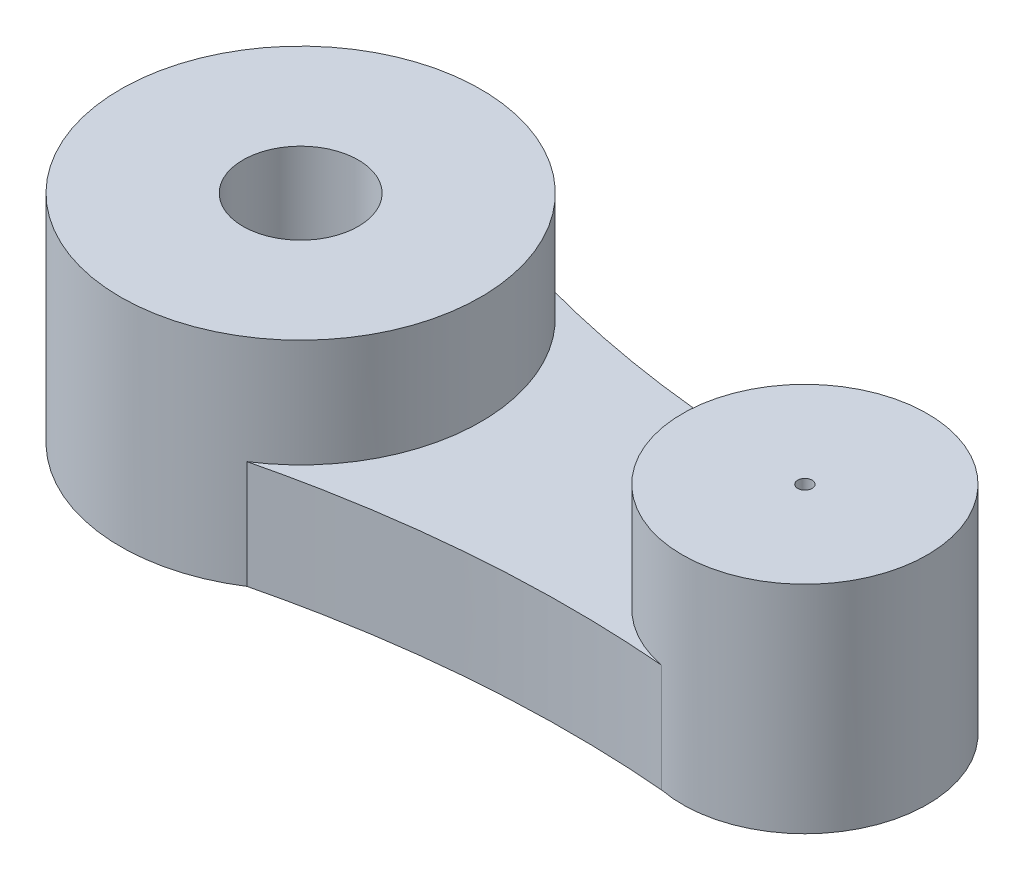
ISO-10303-21;
HEADER;
FILE_DESCRIPTION(('STEP AP214'),'2;1');
FILE_NAME('part.step','',(''),(''),'','','');
FILE_SCHEMA(('AUTOMOTIVE_DESIGN { 1 0 10303 214 1 1 1 1 }'));
ENDSEC;
DATA;
#1=APPLICATION_CONTEXT('core data for automotive mechanical design processes');
#2=APPLICATION_PROTOCOL_DEFINITION('international standard','automotive_design',2000,#1);
#3=PRODUCT_CONTEXT('',#1,'mechanical');
#4=PRODUCT('Part','Part','',(#3));
#5=PRODUCT_RELATED_PRODUCT_CATEGORY('part','',(#4));
#6=PRODUCT_DEFINITION_FORMATION('','',#4);
#7=PRODUCT_DEFINITION_CONTEXT('part definition',#1,'design');
#8=PRODUCT_DEFINITION('design','',#6,#7);
#9=PRODUCT_DEFINITION_SHAPE('','',#8);
#10=(LENGTH_UNIT() NAMED_UNIT(*) SI_UNIT(.MILLI.,.METRE.));
#11=(NAMED_UNIT(*) PLANE_ANGLE_UNIT() SI_UNIT($,.RADIAN.));
#12=(NAMED_UNIT(*) SI_UNIT($,.STERADIAN.) SOLID_ANGLE_UNIT());
#13=UNCERTAINTY_MEASURE_WITH_UNIT(LENGTH_MEASURE(1.E-05),#10,'distance_accuracy_value','');
#14=(GEOMETRIC_REPRESENTATION_CONTEXT(3) GLOBAL_UNCERTAINTY_ASSIGNED_CONTEXT((#13)) GLOBAL_UNIT_ASSIGNED_CONTEXT((#10,
#11,#12)) REPRESENTATION_CONTEXT('',''));
#15=CARTESIAN_POINT('',(0.,0.,0.));
#16=DIRECTION('',(0.,0.,1.));
#17=DIRECTION('',(1.,0.,0.));
#18=AXIS2_PLACEMENT_3D('',#15,#16,#17);
#19=CARTESIAN_POINT('',(0.,15.,0.));
#20=DIRECTION('',(0.,-1.,0.));
#21=DIRECTION('',(0.,0.,-1.));
#22=AXIS2_PLACEMENT_3D('',#19,#20,#21);
#23=CYLINDRICAL_SURFACE('',#22,12.5);
#24=CARTESIAN_POINT('',(0.,15.,0.));
#25=DIRECTION('',(0.,1.,0.));
#26=DIRECTION('',(0.,0.,1.));
#27=AXIS2_PLACEMENT_3D('',#24,#25,#26);
#28=CIRCLE('',#27,12.5);
#29=CARTESIAN_POINT('',(0.,15.,12.5));
#30=VERTEX_POINT('',#29);
#31=EDGE_CURVE('E11',#30,#30,#28,.T.);
#32=ORIENTED_EDGE('',*,*,#31,.F.);
#33=EDGE_LOOP('',(#32));
#34=FACE_BOUND('',#33,.T.);
#35=CARTESIAN_POINT('',(0.,7.5,0.));
#36=DIRECTION('',(0.,1.,0.));
#37=DIRECTION('',(0.,0.,-1.));
#38=AXIS2_PLACEMENT_3D('',#35,#36,#37);
#39=CIRCLE('',#38,12.5);
#40=CARTESIAN_POINT('',(6.77893907780912,7.5,10.5021895326333));
#41=VERTEX_POINT('',#40);
#42=CARTESIAN_POINT('',(6.77893907780912,7.5,-10.5021895326333));
#43=VERTEX_POINT('',#42);
#44=EDGE_CURVE('E64',#41,#43,#39,.T.);
#45=ORIENTED_EDGE('',*,*,#44,.T.);
#46=DIRECTION('',(0.,-1.,0.));
#47=VECTOR('',#46,1.);
#48=CARTESIAN_POINT('',(6.77893907780911,7.5,-10.5021895326333));
#49=LINE('',#48,#47);
#50=CARTESIAN_POINT('',(6.77893907780911,0.,-10.5021895326333));
#51=VERTEX_POINT('',#50);
#52=EDGE_CURVE('E260',#43,#51,#49,.T.);
#53=ORIENTED_EDGE('',*,*,#52,.T.);
#54=CARTESIAN_POINT('',(0.,0.,0.));
#55=DIRECTION('',(0.,1.,0.));
#56=DIRECTION('',(0.,0.,1.));
#57=AXIS2_PLACEMENT_3D('',#54,#55,#56);
#58=CIRCLE('',#57,12.5);
#59=CARTESIAN_POINT('',(6.77893907780912,0.,10.5021895326333));
#60=VERTEX_POINT('',#59);
#61=EDGE_CURVE('E47',#51,#60,#58,.T.);
#62=ORIENTED_EDGE('',*,*,#61,.T.);
#63=DIRECTION('',(0.,-1.,0.));
#64=VECTOR('',#63,1.);
#65=CARTESIAN_POINT('',(6.77893907780912,7.5,10.5021895326333));
#66=LINE('',#65,#64);
#67=EDGE_CURVE('E59',#41,#60,#66,.T.);
#68=ORIENTED_EDGE('',*,*,#67,.F.);
#69=EDGE_LOOP('',(#45,#53,#62,#68));
#70=FACE_BOUND('',#69,.T.);
#71=ADVANCED_FACE('F44',(#34,#70),#23,.T.);
#72=CARTESIAN_POINT('',(0.,15.,0.));
#73=DIRECTION('',(0.,1.,0.));
#74=DIRECTION('',(0.,0.,1.));
#75=AXIS2_PLACEMENT_3D('',#72,#73,#74);
#76=PLANE('',#75);
#77=CARTESIAN_POINT('',(0.,15.,0.));
#78=DIRECTION('',(0.,1.,0.));
#79=DIRECTION('',(0.,0.,1.));
#80=AXIS2_PLACEMENT_3D('',#77,#78,#79);
#81=CIRCLE('',#80,3.99999999999999);
#82=CARTESIAN_POINT('',(0.,15.,3.99999999999999));
#83=VERTEX_POINT('',#82);
#84=EDGE_CURVE('E244',#83,#83,#81,.T.);
#85=ORIENTED_EDGE('',*,*,#84,.F.);
#86=EDGE_LOOP('',(#85));
#87=FACE_BOUND('',#86,.T.);
#88=ORIENTED_EDGE('',*,*,#31,.T.);
#89=EDGE_LOOP('',(#88));
#90=FACE_BOUND('',#89,.T.);
#91=ADVANCED_FACE('F134',(#87,#90),#76,.T.);
#92=CARTESIAN_POINT('',(0.,0.,0.));
#93=DIRECTION('',(0.,1.,0.));
#94=DIRECTION('',(0.,0.,1.));
#95=AXIS2_PLACEMENT_3D('',#92,#93,#94);
#96=PLANE('',#95);
#97=CARTESIAN_POINT('',(35.,0.,0.));
#98=DIRECTION('',(0.,1.,0.));
#99=DIRECTION('',(0.,0.,1.));
#100=AXIS2_PLACEMENT_3D('',#97,#98,#99);
#101=CIRCLE('',#100,0.499999999999999);
#102=CARTESIAN_POINT('',(35.,0.,0.499999999999999));
#103=VERTEX_POINT('',#102);
#104=EDGE_CURVE('E248',#103,#103,#101,.T.);
#105=ORIENTED_EDGE('',*,*,#104,.T.);
#106=EDGE_LOOP('',(#105));
#107=FACE_BOUND('',#106,.T.);
#108=CARTESIAN_POINT('',(0.,0.,0.));
#109=DIRECTION('',(0.,1.,0.));
#110=DIRECTION('',(0.,0.,1.));
#111=AXIS2_PLACEMENT_3D('',#108,#109,#110);
#112=CIRCLE('',#111,4.);
#113=CARTESIAN_POINT('',(0.,0.,4.));
#114=VERTEX_POINT('',#113);
#115=EDGE_CURVE('E239',#114,#114,#112,.T.);
#116=ORIENTED_EDGE('',*,*,#115,.T.);
#117=EDGE_LOOP('',(#116));
#118=FACE_BOUND('',#117,.T.);
#119=ORIENTED_EDGE('',*,*,#61,.F.);
#120=CARTESIAN_POINT('',(6.77893907780912,0.,-10.5021895326333));
#121=CARTESIAN_POINT('',(20.0780701139765,0.,-6.87736251216738));
#122=CARTESIAN_POINT('',(32.9530224181026,0.,-8.24984137903327));
#123=B_SPLINE_CURVE_WITH_KNOTS('',2,(#120,#121,#122),.UNSPECIFIED.,.F.,.F.,(3,3),(0.,
0.617827195606495),.UNSPECIFIED.);
#124=CARTESIAN_POINT('',(32.9530224181026,0.,-8.24984137903326));
#125=VERTEX_POINT('',#124);
#126=EDGE_CURVE('E233',#51,#125,#123,.T.);
#127=ORIENTED_EDGE('',*,*,#126,.T.);
#128=CARTESIAN_POINT('',(35.,0.,0.));
#129=DIRECTION('',(0.,1.,0.));
#130=DIRECTION('',(0.,0.,1.));
#131=AXIS2_PLACEMENT_3D('',#128,#129,#130);
#132=CIRCLE('',#131,8.50000000000001);
#133=CARTESIAN_POINT('',(33.4112747408195,0.,8.3502067070727));
#134=VERTEX_POINT('',#133);
#135=EDGE_CURVE('E234',#134,#125,#132,.T.);
#136=ORIENTED_EDGE('',*,*,#135,.F.);
#137=CARTESIAN_POINT('',(33.4112747408195,0.,8.3502067070727));
#138=CARTESIAN_POINT('',(20.2255071541268,0.,7.23953667088592));
#139=CARTESIAN_POINT('',(6.77893907780912,0.,10.5021895326333));
#140=B_SPLINE_CURVE_WITH_KNOTS('',2,(#137,#138,#139),.UNSPECIFIED.,.F.,.F.,(3,3),(0.,
0.631379274317981),.UNSPECIFIED.);
#141=EDGE_CURVE('E97',#134,#60,#140,.T.);
#142=ORIENTED_EDGE('',*,*,#141,.T.);
#143=EDGE_LOOP('',(#119,#127,#136,#142));
#144=FACE_BOUND('',#143,.T.);
#145=ADVANCED_FACE('F132',(#107,#118,#144),#96,.F.);
#146=CARTESIAN_POINT('',(6.77893907780912,7.5,-10.5021895326333));
#147=CARTESIAN_POINT('',(20.0780701139765,7.5,-6.87736251216738));
#148=CARTESIAN_POINT('',(32.9530224181026,7.5,-8.24984137903327));
#149=B_SPLINE_CURVE_WITH_KNOTS('',2,(#146,#147,#148),.UNSPECIFIED.,.F.,.F.,(3,3),(0.,
0.617827195606495),.UNSPECIFIED.);
#150=DIRECTION('',(0.,-1.,0.));
#151=VECTOR('',#150,1.);
#152=SURFACE_OF_LINEAR_EXTRUSION('',#149,#151);
#153=ORIENTED_EDGE('',*,*,#126,.F.);
#154=ORIENTED_EDGE('',*,*,#52,.F.);
#155=CARTESIAN_POINT('',(32.9530224181026,7.5,-8.24984137903326));
#156=VERTEX_POINT('',#155);
#157=EDGE_CURVE('E108',#43,#156,#149,.T.);
#158=ORIENTED_EDGE('',*,*,#157,.T.);
#159=DIRECTION('',(0.,-1.,0.));
#160=VECTOR('',#159,1.);
#161=CARTESIAN_POINT('',(32.9530224181026,7.5,-8.24984137903326));
#162=LINE('',#161,#160);
#163=EDGE_CURVE('E102',#156,#125,#162,.T.);
#164=ORIENTED_EDGE('',*,*,#163,.T.);
#165=EDGE_LOOP('',(#153,#154,#158,#164));
#166=FACE_BOUND('',#165,.T.);
#167=ADVANCED_FACE('F128',(#166),#152,.T.);
#168=CARTESIAN_POINT('',(33.4112747408195,7.5,8.3502067070727));
#169=CARTESIAN_POINT('',(20.2255071541268,7.5,7.23953667088592));
#170=CARTESIAN_POINT('',(6.77893907780912,7.5,10.5021895326333));
#171=B_SPLINE_CURVE_WITH_KNOTS('',2,(#168,#169,#170),.UNSPECIFIED.,.F.,.F.,(3,3),(0.,
0.631379274317981),.UNSPECIFIED.);
#172=DIRECTION('',(0.,-1.,0.));
#173=VECTOR('',#172,1.);
#174=SURFACE_OF_LINEAR_EXTRUSION('',#171,#173);
#175=ORIENTED_EDGE('',*,*,#141,.F.);
#176=DIRECTION('',(0.,-1.,0.));
#177=VECTOR('',#176,1.);
#178=CARTESIAN_POINT('',(33.4112747408195,7.5,8.3502067070727));
#179=LINE('',#178,#177);
#180=CARTESIAN_POINT('',(33.4112747408195,7.5,8.35020670707271));
#181=VERTEX_POINT('',#180);
#182=EDGE_CURVE('E94',#181,#134,#179,.T.);
#183=ORIENTED_EDGE('',*,*,#182,.F.);
#184=EDGE_CURVE('E83',#181,#41,#171,.T.);
#185=ORIENTED_EDGE('',*,*,#184,.T.);
#186=ORIENTED_EDGE('',*,*,#67,.T.);
#187=EDGE_LOOP('',(#175,#183,#185,#186));
#188=FACE_BOUND('',#187,.T.);
#189=ADVANCED_FACE('F95',(#188),#174,.T.);
#190=CARTESIAN_POINT('',(19.9720254309662,7.5,-8.12668898400033));
#191=DIRECTION('',(0.,-1.,0.));
#192=DIRECTION('',(0.,0.,-1.));
#193=AXIS2_PLACEMENT_3D('',#190,#191,#192);
#194=PLANE('',#193);
#195=ORIENTED_EDGE('',*,*,#157,.F.);
#196=ORIENTED_EDGE('',*,*,#44,.F.);
#197=ORIENTED_EDGE('',*,*,#184,.F.);
#198=CARTESIAN_POINT('',(35.,7.5,0.));
#199=DIRECTION('',(0.,1.,0.));
#200=DIRECTION('',(0.,0.,1.));
#201=AXIS2_PLACEMENT_3D('',#198,#199,#200);
#202=CIRCLE('',#201,8.50000000000001);
#203=EDGE_CURVE('E88',#156,#181,#202,.T.);
#204=ORIENTED_EDGE('',*,*,#203,.F.);
#205=EDGE_LOOP('',(#195,#196,#197,#204));
#206=FACE_BOUND('',#205,.T.);
#207=ADVANCED_FACE('F86',(#206),#194,.F.);
#208=CARTESIAN_POINT('',(35.,15.,0.));
#209=DIRECTION('',(0.,-1.,0.));
#210=DIRECTION('',(0.,0.,-1.));
#211=AXIS2_PLACEMENT_3D('',#208,#209,#210);
#212=CYLINDRICAL_SURFACE('',#211,8.50000000000001);
#213=ORIENTED_EDGE('',*,*,#163,.F.);
#214=ORIENTED_EDGE('',*,*,#203,.T.);
#215=ORIENTED_EDGE('',*,*,#182,.T.);
#216=ORIENTED_EDGE('',*,*,#135,.T.);
#217=EDGE_LOOP('',(#213,#214,#215,#216));
#218=FACE_BOUND('',#217,.T.);
#219=CARTESIAN_POINT('',(35.,15.,0.));
#220=DIRECTION('',(0.,1.,0.));
#221=DIRECTION('',(0.,0.,1.));
#222=AXIS2_PLACEMENT_3D('',#219,#220,#221);
#223=CIRCLE('',#222,8.50000000000001);
#224=CARTESIAN_POINT('',(35.,15.,8.50000000000001));
#225=VERTEX_POINT('',#224);
#226=EDGE_CURVE('E231',#225,#225,#223,.T.);
#227=ORIENTED_EDGE('',*,*,#226,.F.);
#228=EDGE_LOOP('',(#227));
#229=FACE_BOUND('',#228,.T.);
#230=ADVANCED_FACE('F105',(#218,#229),#212,.T.);
#231=CARTESIAN_POINT('',(35.,15.,0.));
#232=DIRECTION('',(0.,1.,0.));
#233=DIRECTION('',(0.,0.,1.));
#234=AXIS2_PLACEMENT_3D('',#231,#232,#233);
#235=PLANE('',#234);
#236=CARTESIAN_POINT('',(35.,15.,0.));
#237=DIRECTION('',(0.,1.,0.));
#238=DIRECTION('',(0.,0.,1.));
#239=AXIS2_PLACEMENT_3D('',#236,#237,#238);
#240=CIRCLE('',#239,0.499999999999999);
#241=CARTESIAN_POINT('',(35.,15.,0.499999999999999));
#242=VERTEX_POINT('',#241);
#243=EDGE_CURVE('E228',#242,#242,#240,.T.);
#244=ORIENTED_EDGE('',*,*,#243,.F.);
#245=EDGE_LOOP('',(#244));
#246=FACE_BOUND('',#245,.T.);
#247=ORIENTED_EDGE('',*,*,#226,.T.);
#248=EDGE_LOOP('',(#247));
#249=FACE_BOUND('',#248,.T.);
#250=ADVANCED_FACE('F175',(#246,#249),#235,.T.);
#251=CARTESIAN_POINT('',(0.,15.,0.));
#252=DIRECTION('',(0.,1.,0.));
#253=DIRECTION('',(0.,0.,1.));
#254=AXIS2_PLACEMENT_3D('',#251,#252,#253);
#255=CYLINDRICAL_SURFACE('',#254,3.99999999999999);
#256=ORIENTED_EDGE('',*,*,#115,.F.);
#257=EDGE_LOOP('',(#256));
#258=FACE_BOUND('',#257,.T.);
#259=ORIENTED_EDGE('',*,*,#84,.T.);
#260=EDGE_LOOP('',(#259));
#261=FACE_BOUND('',#260,.T.);
#262=ADVANCED_FACE('F185',(#258,#261),#255,.F.);
#263=CARTESIAN_POINT('',(35.,0.,0.));
#264=DIRECTION('',(0.,1.,0.));
#265=DIRECTION('',(0.,0.,1.));
#266=AXIS2_PLACEMENT_3D('',#263,#264,#265);
#267=CYLINDRICAL_SURFACE('',#266,0.499999999999999);
#268=ORIENTED_EDGE('',*,*,#104,.F.);
#269=EDGE_LOOP('',(#268));
#270=FACE_BOUND('',#269,.T.);
#271=ORIENTED_EDGE('',*,*,#243,.T.);
#272=EDGE_LOOP('',(#271));
#273=FACE_BOUND('',#272,.T.);
#274=ADVANCED_FACE('F187',(#270,#273),#267,.F.);
#275=CLOSED_SHELL('',(#71,#91,#145,#167,#189,#207,#230,#250,#262,#274));
#276=MANIFOLD_SOLID_BREP('B2',#275);
#277=ADVANCED_BREP_SHAPE_REPRESENTATION('',(#18,#276),#14);
#278=SHAPE_DEFINITION_REPRESENTATION(#9,#277);
ENDSEC;
END-ISO-10303-21;
